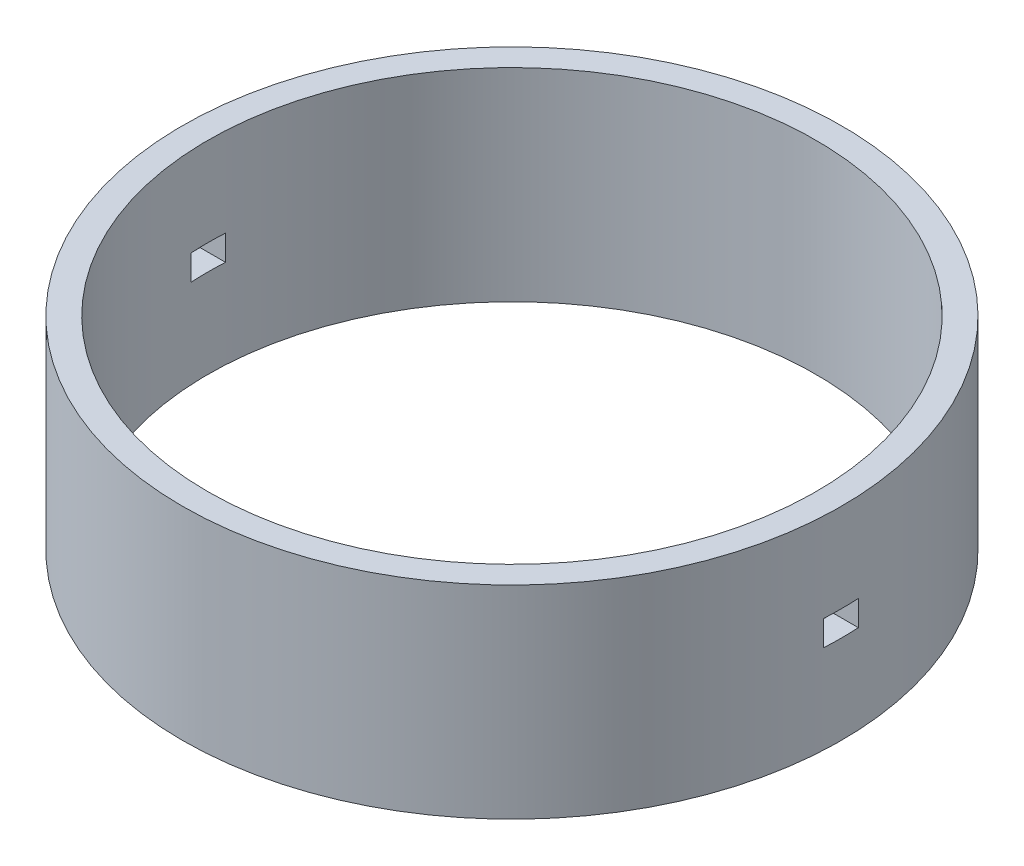
ISO-10303-21;
HEADER;
FILE_DESCRIPTION(('STEP AP214'),'2;1');
FILE_NAME('part.step','',(''),(''),'','','');
FILE_SCHEMA(('AUTOMOTIVE_DESIGN { 1 0 10303 214 1 1 1 1 }'));
ENDSEC;
DATA;
#1=APPLICATION_CONTEXT('core data for automotive mechanical design processes');
#2=APPLICATION_PROTOCOL_DEFINITION('international standard','automotive_design',2000,#1);
#3=PRODUCT_CONTEXT('',#1,'mechanical');
#4=PRODUCT('Part','Part','',(#3));
#5=PRODUCT_RELATED_PRODUCT_CATEGORY('part','',(#4));
#6=PRODUCT_DEFINITION_FORMATION('','',#4);
#7=PRODUCT_DEFINITION_CONTEXT('part definition',#1,'design');
#8=PRODUCT_DEFINITION('design','',#6,#7);
#9=PRODUCT_DEFINITION_SHAPE('','',#8);
#10=(LENGTH_UNIT() NAMED_UNIT(*) SI_UNIT(.MILLI.,.METRE.));
#11=(NAMED_UNIT(*) PLANE_ANGLE_UNIT() SI_UNIT($,.RADIAN.));
#12=(NAMED_UNIT(*) SI_UNIT($,.STERADIAN.) SOLID_ANGLE_UNIT());
#13=UNCERTAINTY_MEASURE_WITH_UNIT(LENGTH_MEASURE(1.E-05),#10,'distance_accuracy_value','');
#14=(GEOMETRIC_REPRESENTATION_CONTEXT(3) GLOBAL_UNCERTAINTY_ASSIGNED_CONTEXT((#13)) GLOBAL_UNIT_ASSIGNED_CONTEXT((#10,
#11,#12)) REPRESENTATION_CONTEXT('',''));
#15=CARTESIAN_POINT('',(0.,0.,0.));
#16=DIRECTION('',(0.,0.,1.));
#17=DIRECTION('',(1.,0.,0.));
#18=AXIS2_PLACEMENT_3D('',#15,#16,#17);
#19=CARTESIAN_POINT('',(0.,609.6,0.));
#20=DIRECTION('',(0.,1.,0.));
#21=DIRECTION('',(0.,0.,1.));
#22=AXIS2_PLACEMENT_3D('',#19,#20,#21);
#23=PLANE('',#22);
#24=CARTESIAN_POINT('',(0.,609.6,0.));
#25=DIRECTION('',(0.,1.,0.));
#26=DIRECTION('',(0.,0.,1.));
#27=AXIS2_PLACEMENT_3D('',#24,#25,#26);
#28=CIRCLE('',#27,1981.2);
#29=CARTESIAN_POINT('',(0.,609.6,1981.2));
#30=VERTEX_POINT('',#29);
#31=EDGE_CURVE('E117',#30,#30,#28,.T.);
#32=ORIENTED_EDGE('',*,*,#31,.T.);
#33=EDGE_LOOP('',(#32));
#34=FACE_BOUND('',#33,.T.);
#35=CARTESIAN_POINT('',(0.,609.6,0.));
#36=DIRECTION('',(0.,1.,0.));
#37=DIRECTION('',(0.,0.,1.));
#38=AXIS2_PLACEMENT_3D('',#35,#36,#37);
#39=CIRCLE('',#38,1828.8);
#40=CARTESIAN_POINT('',(0.,609.6,1828.8));
#41=VERTEX_POINT('',#40);
#42=EDGE_CURVE('E196',#41,#41,#39,.T.);
#43=ORIENTED_EDGE('',*,*,#42,.F.);
#44=EDGE_LOOP('',(#43));
#45=FACE_BOUND('',#44,.T.);
#46=ADVANCED_FACE('F38',(#34,#45),#23,.T.);
#47=CARTESIAN_POINT('',(0.,-609.6,0.));
#48=DIRECTION('',(0.,1.,0.));
#49=DIRECTION('',(0.,0.,1.));
#50=AXIS2_PLACEMENT_3D('',#47,#48,#49);
#51=PLANE('',#50);
#52=CARTESIAN_POINT('',(0.,-609.6,0.));
#53=DIRECTION('',(0.,1.,0.));
#54=DIRECTION('',(0.,0.,1.));
#55=AXIS2_PLACEMENT_3D('',#52,#53,#54);
#56=CIRCLE('',#55,1981.2);
#57=CARTESIAN_POINT('',(0.,-609.6,1981.2));
#58=VERTEX_POINT('',#57);
#59=EDGE_CURVE('E200',#58,#58,#56,.T.);
#60=ORIENTED_EDGE('',*,*,#59,.F.);
#61=EDGE_LOOP('',(#60));
#62=FACE_BOUND('',#61,.T.);
#63=CARTESIAN_POINT('',(0.,-609.6,0.));
#64=DIRECTION('',(0.,1.,0.));
#65=DIRECTION('',(0.,0.,1.));
#66=AXIS2_PLACEMENT_3D('',#63,#64,#65);
#67=CIRCLE('',#66,1828.8);
#68=CARTESIAN_POINT('',(0.,-609.6,1828.8));
#69=VERTEX_POINT('',#68);
#70=EDGE_CURVE('E195',#69,#69,#67,.T.);
#71=ORIENTED_EDGE('',*,*,#70,.T.);
#72=EDGE_LOOP('',(#71));
#73=FACE_BOUND('',#72,.T.);
#74=ADVANCED_FACE('F211',(#62,#73),#51,.F.);
#75=CARTESIAN_POINT('',(0.,609.6,0.));
#76=DIRECTION('',(0.,-1.,0.));
#77=DIRECTION('',(0.,0.,-1.));
#78=AXIS2_PLACEMENT_3D('',#75,#76,#77);
#79=CYLINDRICAL_SURFACE('',#78,1981.2);
#80=DIRECTION('',(0.,-1.,0.));
#81=VECTOR('',#80,1.);
#82=CARTESIAN_POINT('',(-1978.46109398189,609.6,-104.14));
#83=LINE('',#82,#81);
#84=CARTESIAN_POINT('',(-1978.46109398189,-76.1999999999999,-104.14));
#85=VERTEX_POINT('',#84);
#86=CARTESIAN_POINT('',(-1978.46109398189,76.2,-104.14));
#87=VERTEX_POINT('',#86);
#88=EDGE_CURVE('E190',#85,#87,#83,.F.);
#89=ORIENTED_EDGE('',*,*,#88,.T.);
#90=CARTESIAN_POINT('',(0.,76.2,0.));
#91=DIRECTION('',(0.,1.,0.));
#92=DIRECTION('',(0.,0.,1.));
#93=AXIS2_PLACEMENT_3D('',#90,#91,#92);
#94=CIRCLE('',#93,1981.2);
#95=CARTESIAN_POINT('',(-1978.46109398189,76.2,104.14));
#96=VERTEX_POINT('',#95);
#97=EDGE_CURVE('E54',#87,#96,#94,.T.);
#98=ORIENTED_EDGE('',*,*,#97,.T.);
#99=DIRECTION('',(0.,-1.,0.));
#100=VECTOR('',#99,1.);
#101=CARTESIAN_POINT('',(-1978.46109398189,609.6,104.14));
#102=LINE('',#101,#100);
#103=CARTESIAN_POINT('',(-1978.46109398189,-76.2,104.14));
#104=VERTEX_POINT('',#103);
#105=EDGE_CURVE('E124',#96,#104,#102,.T.);
#106=ORIENTED_EDGE('',*,*,#105,.T.);
#107=CARTESIAN_POINT('',(0.,-76.1999999999999,0.));
#108=DIRECTION('',(0.,-1.,0.));
#109=DIRECTION('',(0.,0.,-1.));
#110=AXIS2_PLACEMENT_3D('',#107,#108,#109);
#111=CIRCLE('',#110,1981.2);
#112=EDGE_CURVE('E186',#104,#85,#111,.T.);
#113=ORIENTED_EDGE('',*,*,#112,.T.);
#114=EDGE_LOOP('',(#89,#98,#106,#113));
#115=FACE_BOUND('',#114,.T.);
#116=DIRECTION('',(0.,-1.,0.));
#117=VECTOR('',#116,1.);
#118=CARTESIAN_POINT('',(1978.46109398189,609.6,104.14));
#119=LINE('',#118,#117);
#120=CARTESIAN_POINT('',(1978.46109398189,-76.2,104.14));
#121=VERTEX_POINT('',#120);
#122=CARTESIAN_POINT('',(1978.46109398189,76.2,104.14));
#123=VERTEX_POINT('',#122);
#124=EDGE_CURVE('E172',#121,#123,#119,.F.);
#125=ORIENTED_EDGE('',*,*,#124,.T.);
#126=CARTESIAN_POINT('',(1978.46109398189,76.2,-104.14));
#127=VERTEX_POINT('',#126);
#128=EDGE_CURVE('E62',#123,#127,#94,.T.);
#129=ORIENTED_EDGE('',*,*,#128,.T.);
#130=DIRECTION('',(0.,-1.,0.));
#131=VECTOR('',#130,1.);
#132=CARTESIAN_POINT('',(1978.46109398189,609.6,-104.14));
#133=LINE('',#132,#131);
#134=CARTESIAN_POINT('',(1978.46109398189,-76.1999999999999,-104.14));
#135=VERTEX_POINT('',#134);
#136=EDGE_CURVE('E162',#127,#135,#133,.T.);
#137=ORIENTED_EDGE('',*,*,#136,.T.);
#138=EDGE_CURVE('E187',#135,#121,#111,.T.);
#139=ORIENTED_EDGE('',*,*,#138,.T.);
#140=EDGE_LOOP('',(#125,#129,#137,#139));
#141=FACE_BOUND('',#140,.T.);
#142=ORIENTED_EDGE('',*,*,#31,.F.);
#143=EDGE_LOOP('',(#142));
#144=FACE_BOUND('',#143,.T.);
#145=ORIENTED_EDGE('',*,*,#59,.T.);
#146=EDGE_LOOP('',(#145));
#147=FACE_BOUND('',#146,.T.);
#148=ADVANCED_FACE('F40',(#115,#141,#144,#147),#79,.T.);
#149=CARTESIAN_POINT('',(0.,609.6,0.));
#150=DIRECTION('',(0.,-1.,0.));
#151=DIRECTION('',(0.,0.,-1.));
#152=AXIS2_PLACEMENT_3D('',#149,#150,#151);
#153=CYLINDRICAL_SURFACE('',#152,1828.8);
#154=DIRECTION('',(0.,-1.,0.));
#155=VECTOR('',#154,1.);
#156=CARTESIAN_POINT('',(1825.83249516488,609.6,-104.14));
#157=LINE('',#156,#155);
#158=CARTESIAN_POINT('',(1825.83249516488,76.2,-104.14));
#159=VERTEX_POINT('',#158);
#160=CARTESIAN_POINT('',(1825.83249516488,-76.1999999999999,-104.14));
#161=VERTEX_POINT('',#160);
#162=EDGE_CURVE('E11',#159,#161,#157,.T.);
#163=ORIENTED_EDGE('',*,*,#162,.F.);
#164=CARTESIAN_POINT('',(0.,76.2,0.));
#165=DIRECTION('',(0.,1.,0.));
#166=DIRECTION('',(0.,0.,1.));
#167=AXIS2_PLACEMENT_3D('',#164,#165,#166);
#168=CIRCLE('',#167,1828.8);
#169=CARTESIAN_POINT('',(1825.83249516488,76.2,104.14));
#170=VERTEX_POINT('',#169);
#171=EDGE_CURVE('E119',#170,#159,#168,.T.);
#172=ORIENTED_EDGE('',*,*,#171,.F.);
#173=DIRECTION('',(0.,-1.,0.));
#174=VECTOR('',#173,1.);
#175=CARTESIAN_POINT('',(1825.83249516488,609.6,104.14));
#176=LINE('',#175,#174);
#177=CARTESIAN_POINT('',(1825.83249516488,-76.2,104.14));
#178=VERTEX_POINT('',#177);
#179=EDGE_CURVE('E141',#178,#170,#176,.F.);
#180=ORIENTED_EDGE('',*,*,#179,.F.);
#181=CARTESIAN_POINT('',(0.,-76.1999999999999,0.));
#182=DIRECTION('',(0.,-1.,0.));
#183=DIRECTION('',(0.,0.,-1.));
#184=AXIS2_PLACEMENT_3D('',#181,#182,#183);
#185=CIRCLE('',#184,1828.8);
#186=EDGE_CURVE('E47',#161,#178,#185,.T.);
#187=ORIENTED_EDGE('',*,*,#186,.F.);
#188=EDGE_LOOP('',(#163,#172,#180,#187));
#189=FACE_BOUND('',#188,.T.);
#190=DIRECTION('',(0.,-1.,0.));
#191=VECTOR('',#190,1.);
#192=CARTESIAN_POINT('',(-1825.83249516488,609.6,-104.14));
#193=LINE('',#192,#191);
#194=CARTESIAN_POINT('',(-1825.83249516488,-76.1999999999999,-104.14));
#195=VERTEX_POINT('',#194);
#196=CARTESIAN_POINT('',(-1825.83249516488,76.2,-104.14));
#197=VERTEX_POINT('',#196);
#198=EDGE_CURVE('E136',#195,#197,#193,.F.);
#199=ORIENTED_EDGE('',*,*,#198,.F.);
#200=CARTESIAN_POINT('',(-1825.83249516488,-76.2,104.14));
#201=VERTEX_POINT('',#200);
#202=EDGE_CURVE('E132',#201,#195,#185,.T.);
#203=ORIENTED_EDGE('',*,*,#202,.F.);
#204=DIRECTION('',(0.,-1.,0.));
#205=VECTOR('',#204,1.);
#206=CARTESIAN_POINT('',(-1825.83249516488,609.6,104.14));
#207=LINE('',#206,#205);
#208=CARTESIAN_POINT('',(-1825.83249516488,76.2,104.14));
#209=VERTEX_POINT('',#208);
#210=EDGE_CURVE('E116',#209,#201,#207,.T.);
#211=ORIENTED_EDGE('',*,*,#210,.F.);
#212=EDGE_CURVE('E104',#197,#209,#168,.T.);
#213=ORIENTED_EDGE('',*,*,#212,.F.);
#214=EDGE_LOOP('',(#199,#203,#211,#213));
#215=FACE_BOUND('',#214,.T.);
#216=ORIENTED_EDGE('',*,*,#42,.T.);
#217=EDGE_LOOP('',(#216));
#218=FACE_BOUND('',#217,.T.);
#219=ORIENTED_EDGE('',*,*,#70,.F.);
#220=EDGE_LOOP('',(#219));
#221=FACE_BOUND('',#220,.T.);
#222=ADVANCED_FACE('F130',(#189,#215,#218,#221),#153,.F.);
#223=CARTESIAN_POINT('',(-1981.2,76.2,104.14));
#224=DIRECTION('',(0.,1.,0.));
#225=DIRECTION('',(0.,0.,1.));
#226=AXIS2_PLACEMENT_3D('',#223,#224,#225);
#227=PLANE('',#226);
#228=DIRECTION('',(1.,0.,0.));
#229=VECTOR('',#228,1.);
#230=CARTESIAN_POINT('',(-1981.2,76.2,-104.14));
#231=LINE('',#230,#229);
#232=EDGE_CURVE('E110',#87,#197,#231,.T.);
#233=ORIENTED_EDGE('',*,*,#232,.T.);
#234=ORIENTED_EDGE('',*,*,#212,.T.);
#235=DIRECTION('',(1.,0.,0.));
#236=VECTOR('',#235,1.);
#237=CARTESIAN_POINT('',(-1981.2,76.2,104.14));
#238=LINE('',#237,#236);
#239=EDGE_CURVE('E107',#96,#209,#238,.T.);
#240=ORIENTED_EDGE('',*,*,#239,.F.);
#241=ORIENTED_EDGE('',*,*,#97,.F.);
#242=EDGE_LOOP('',(#233,#234,#240,#241));
#243=FACE_BOUND('',#242,.T.);
#244=ADVANCED_FACE('F106',(#243),#227,.F.);
#245=CARTESIAN_POINT('',(-1981.2,-76.2,104.14));
#246=DIRECTION('',(0.,0.,1.));
#247=DIRECTION('',(1.,0.,0.));
#248=AXIS2_PLACEMENT_3D('',#245,#246,#247);
#249=PLANE('',#248);
#250=ORIENTED_EDGE('',*,*,#239,.T.);
#251=ORIENTED_EDGE('',*,*,#210,.T.);
#252=DIRECTION('',(1.,0.,0.));
#253=VECTOR('',#252,1.);
#254=CARTESIAN_POINT('',(-1981.2,-76.2,104.14));
#255=LINE('',#254,#253);
#256=EDGE_CURVE('E174',#104,#201,#255,.T.);
#257=ORIENTED_EDGE('',*,*,#256,.F.);
#258=ORIENTED_EDGE('',*,*,#105,.F.);
#259=EDGE_LOOP('',(#250,#251,#257,#258));
#260=FACE_BOUND('',#259,.T.);
#261=ADVANCED_FACE('F121',(#260),#249,.F.);
#262=CARTESIAN_POINT('',(-1981.2,-76.2,104.14));
#263=DIRECTION('',(0.,-1.,0.));
#264=DIRECTION('',(0.,0.,-1.));
#265=AXIS2_PLACEMENT_3D('',#262,#263,#264);
#266=PLANE('',#265);
#267=ORIENTED_EDGE('',*,*,#256,.T.);
#268=ORIENTED_EDGE('',*,*,#202,.T.);
#269=DIRECTION('',(1.,0.,0.));
#270=VECTOR('',#269,1.);
#271=CARTESIAN_POINT('',(-1981.2,-76.2,-104.14));
#272=LINE('',#271,#270);
#273=EDGE_CURVE('E313',#85,#195,#272,.T.);
#274=ORIENTED_EDGE('',*,*,#273,.F.);
#275=ORIENTED_EDGE('',*,*,#112,.F.);
#276=EDGE_LOOP('',(#267,#268,#274,#275));
#277=FACE_BOUND('',#276,.T.);
#278=ADVANCED_FACE('F257',(#277),#266,.F.);
#279=CARTESIAN_POINT('',(-1981.2,-76.2,-104.14));
#280=DIRECTION('',(0.,0.,-1.));
#281=DIRECTION('',(-1.,0.,0.));
#282=AXIS2_PLACEMENT_3D('',#279,#280,#281);
#283=PLANE('',#282);
#284=ORIENTED_EDGE('',*,*,#273,.T.);
#285=ORIENTED_EDGE('',*,*,#198,.T.);
#286=ORIENTED_EDGE('',*,*,#232,.F.);
#287=ORIENTED_EDGE('',*,*,#88,.F.);
#288=EDGE_LOOP('',(#284,#285,#286,#287));
#289=FACE_BOUND('',#288,.T.);
#290=ADVANCED_FACE('F264',(#289),#283,.F.);
#291=EDGE_CURVE('E154',#159,#127,#231,.T.);
#292=ORIENTED_EDGE('',*,*,#291,.F.);
#293=ORIENTED_EDGE('',*,*,#162,.T.);
#294=EDGE_CURVE('E169',#161,#135,#272,.T.);
#295=ORIENTED_EDGE('',*,*,#294,.T.);
#296=ORIENTED_EDGE('',*,*,#136,.F.);
#297=EDGE_LOOP('',(#292,#293,#295,#296));
#298=FACE_BOUND('',#297,.T.);
#299=ADVANCED_FACE('F159',(#298),#283,.F.);
#300=ORIENTED_EDGE('',*,*,#294,.F.);
#301=ORIENTED_EDGE('',*,*,#186,.T.);
#302=EDGE_CURVE('E126',#178,#121,#255,.T.);
#303=ORIENTED_EDGE('',*,*,#302,.T.);
#304=ORIENTED_EDGE('',*,*,#138,.F.);
#305=EDGE_LOOP('',(#300,#301,#303,#304));
#306=FACE_BOUND('',#305,.T.);
#307=ADVANCED_FACE('F168',(#306),#266,.F.);
#308=ORIENTED_EDGE('',*,*,#302,.F.);
#309=ORIENTED_EDGE('',*,*,#179,.T.);
#310=EDGE_CURVE('E127',#170,#123,#238,.T.);
#311=ORIENTED_EDGE('',*,*,#310,.T.);
#312=ORIENTED_EDGE('',*,*,#124,.F.);
#313=EDGE_LOOP('',(#308,#309,#311,#312));
#314=FACE_BOUND('',#313,.T.);
#315=ADVANCED_FACE('F171',(#314),#249,.F.);
#316=ORIENTED_EDGE('',*,*,#310,.F.);
#317=ORIENTED_EDGE('',*,*,#171,.T.);
#318=ORIENTED_EDGE('',*,*,#291,.T.);
#319=ORIENTED_EDGE('',*,*,#128,.F.);
#320=EDGE_LOOP('',(#316,#317,#318,#319));
#321=FACE_BOUND('',#320,.T.);
#322=ADVANCED_FACE('F153',(#321),#227,.F.);
#323=CLOSED_SHELL('',(#46,#74,#148,#222,#244,#261,#278,#290,#299,#307,#315,#322));
#324=MANIFOLD_SOLID_BREP('B2',#323);
#325=ADVANCED_BREP_SHAPE_REPRESENTATION('',(#18,#324),#14);
#326=SHAPE_DEFINITION_REPRESENTATION(#9,#325);
ENDSEC;
END-ISO-10303-21;
